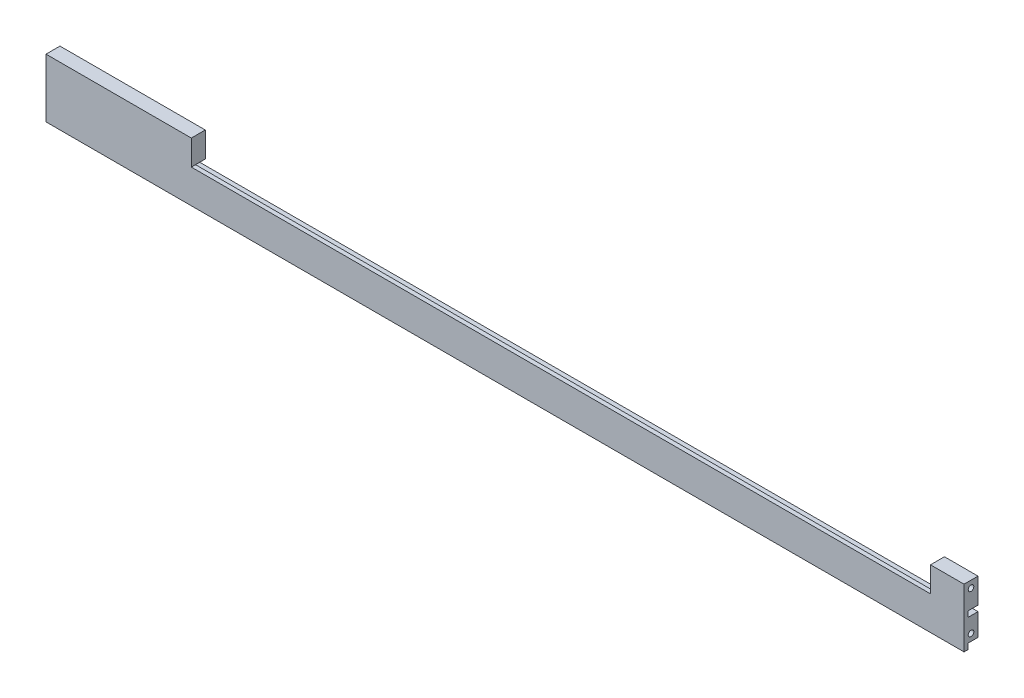
ISO-10303-21;
HEADER;
FILE_DESCRIPTION(('STEP AP214'),'2;1');
FILE_NAME('part.step','',(''),(''),'','','');
FILE_SCHEMA(('AUTOMOTIVE_DESIGN { 1 0 10303 214 1 1 1 1 }'));
ENDSEC;
DATA;
#1=APPLICATION_CONTEXT('core data for automotive mechanical design processes');
#2=APPLICATION_PROTOCOL_DEFINITION('international standard','automotive_design',2000,#1);
#3=PRODUCT_CONTEXT('',#1,'mechanical');
#4=PRODUCT('Part','Part','',(#3));
#5=PRODUCT_RELATED_PRODUCT_CATEGORY('part','',(#4));
#6=PRODUCT_DEFINITION_FORMATION('','',#4);
#7=PRODUCT_DEFINITION_CONTEXT('part definition',#1,'design');
#8=PRODUCT_DEFINITION('design','',#6,#7);
#9=PRODUCT_DEFINITION_SHAPE('','',#8);
#10=(LENGTH_UNIT() NAMED_UNIT(*) SI_UNIT(.MILLI.,.METRE.));
#11=(NAMED_UNIT(*) PLANE_ANGLE_UNIT() SI_UNIT($,.RADIAN.));
#12=(NAMED_UNIT(*) SI_UNIT($,.STERADIAN.) SOLID_ANGLE_UNIT());
#13=UNCERTAINTY_MEASURE_WITH_UNIT(LENGTH_MEASURE(1.E-05),#10,'distance_accuracy_value','');
#14=(GEOMETRIC_REPRESENTATION_CONTEXT(3) GLOBAL_UNCERTAINTY_ASSIGNED_CONTEXT((#13)) GLOBAL_UNIT_ASSIGNED_CONTEXT((#10,
#11,#12)) REPRESENTATION_CONTEXT('',''));
#15=CARTESIAN_POINT('',(0.,0.,0.));
#16=DIRECTION('',(0.,0.,1.));
#17=DIRECTION('',(1.,0.,0.));
#18=AXIS2_PLACEMENT_3D('',#15,#16,#17);
#19=CARTESIAN_POINT('',(-482.706212002234,28.610388862915,10.));
#20=DIRECTION('',(1.,0.,0.));
#21=DIRECTION('',(0.,0.,-1.));
#22=AXIS2_PLACEMENT_3D('',#19,#20,#21);
#23=PLANE('',#22);
#24=CARTESIAN_POINT('',(-482.706212002234,23.610388862915,5.));
#25=DIRECTION('',(-1.,0.,0.));
#26=DIRECTION('',(0.,0.,1.));
#27=AXIS2_PLACEMENT_3D('',#24,#25,#26);
#28=CIRCLE('',#27,2.);
#29=CARTESIAN_POINT('',(-482.706212002234,23.610388862915,7.));
#30=VERTEX_POINT('',#29);
#31=EDGE_CURVE('E330',#30,#30,#28,.T.);
#32=ORIENTED_EDGE('',*,*,#31,.F.);
#33=EDGE_LOOP('',(#32));
#34=FACE_BOUND('',#33,.T.);
#35=CARTESIAN_POINT('',(-482.706212002234,-4.38961113708493,5.));
#36=DIRECTION('',(-1.,0.,0.));
#37=DIRECTION('',(0.,0.,1.));
#38=AXIS2_PLACEMENT_3D('',#35,#36,#37);
#39=CIRCLE('',#38,2.);
#40=CARTESIAN_POINT('',(-482.706212002234,-4.38961113708493,7.));
#41=VERTEX_POINT('',#40);
#42=EDGE_CURVE('E320',#41,#41,#39,.T.);
#43=ORIENTED_EDGE('',*,*,#42,.F.);
#44=EDGE_LOOP('',(#43));
#45=FACE_BOUND('',#44,.T.);
#46=DIRECTION('',(0.,0.,-1.));
#47=VECTOR('',#46,1.);
#48=CARTESIAN_POINT('',(-482.706212002234,-9.38961113708493,7.));
#49=LINE('',#48,#47);
#50=CARTESIAN_POINT('',(-482.706212002234,-9.38961113708493,7.));
#51=VERTEX_POINT('',#50);
#52=CARTESIAN_POINT('',(-482.706212002234,-9.38961113708493,0.));
#53=VERTEX_POINT('',#52);
#54=EDGE_CURVE('E51',#51,#53,#49,.T.);
#55=ORIENTED_EDGE('',*,*,#54,.F.);
#56=DIRECTION('',(0.,1.,0.));
#57=VECTOR('',#56,1.);
#58=CARTESIAN_POINT('',(-482.706212002234,-13.3896111370849,7.));
#59=LINE('',#58,#57);
#60=CARTESIAN_POINT('',(-482.706212002234,-13.3896111370849,7.));
#61=VERTEX_POINT('',#60);
#62=EDGE_CURVE('E148',#61,#51,#59,.T.);
#63=ORIENTED_EDGE('',*,*,#62,.F.);
#64=DIRECTION('',(0.,0.,-1.));
#65=VECTOR('',#64,1.);
#66=CARTESIAN_POINT('',(-482.706212002234,-13.3896111370849,10.));
#67=LINE('',#66,#65);
#68=CARTESIAN_POINT('',(-482.706212002234,-13.3896111370849,10.));
#69=VERTEX_POINT('',#68);
#70=EDGE_CURVE('E240',#69,#61,#67,.T.);
#71=ORIENTED_EDGE('',*,*,#70,.F.);
#72=DIRECTION('',(0.,-1.,0.));
#73=VECTOR('',#72,1.);
#74=CARTESIAN_POINT('',(-482.706212002234,28.610388862915,10.));
#75=LINE('',#74,#73);
#76=CARTESIAN_POINT('',(-482.706212002234,28.610388862915,10.));
#77=VERTEX_POINT('',#76);
#78=EDGE_CURVE('E211',#77,#69,#75,.T.);
#79=ORIENTED_EDGE('',*,*,#78,.F.);
#80=DIRECTION('',(0.,0.,-1.));
#81=VECTOR('',#80,1.);
#82=CARTESIAN_POINT('',(-482.706212002234,28.610388862915,10.));
#83=LINE('',#82,#81);
#84=CARTESIAN_POINT('',(-482.706212002234,28.610388862915,0.));
#85=VERTEX_POINT('',#84);
#86=EDGE_CURVE('E242',#77,#85,#83,.T.);
#87=ORIENTED_EDGE('',*,*,#86,.T.);
#88=DIRECTION('',(0.,-1.,0.));
#89=VECTOR('',#88,1.);
#90=CARTESIAN_POINT('',(-482.706212002234,28.610388862915,0.));
#91=LINE('',#90,#89);
#92=CARTESIAN_POINT('',(-482.706212002234,10.6103888629151,0.));
#93=VERTEX_POINT('',#92);
#94=EDGE_CURVE('E226',#85,#93,#91,.T.);
#95=ORIENTED_EDGE('',*,*,#94,.T.);
#96=DIRECTION('',(0.,0.,-1.));
#97=VECTOR('',#96,1.);
#98=CARTESIAN_POINT('',(-482.706212002234,10.6103888629151,7.));
#99=LINE('',#98,#97);
#100=CARTESIAN_POINT('',(-482.706212002234,10.6103888629151,7.));
#101=VERTEX_POINT('',#100);
#102=EDGE_CURVE('E190',#101,#93,#99,.T.);
#103=ORIENTED_EDGE('',*,*,#102,.F.);
#104=DIRECTION('',(0.,1.,0.));
#105=VECTOR('',#104,1.);
#106=CARTESIAN_POINT('',(-482.706212002234,10.6103888629151,7.));
#107=LINE('',#106,#105);
#108=CARTESIAN_POINT('',(-482.706212002234,6.61038886291507,7.));
#109=VERTEX_POINT('',#108);
#110=EDGE_CURVE('E177',#109,#101,#107,.T.);
#111=ORIENTED_EDGE('',*,*,#110,.F.);
#112=DIRECTION('',(0.,0.,-1.));
#113=VECTOR('',#112,1.);
#114=CARTESIAN_POINT('',(-482.706212002234,6.61038886291507,7.));
#115=LINE('',#114,#113);
#116=CARTESIAN_POINT('',(-482.706212002234,6.61038886291507,0.));
#117=VERTEX_POINT('',#116);
#118=EDGE_CURVE('E192',#109,#117,#115,.T.);
#119=ORIENTED_EDGE('',*,*,#118,.T.);
#120=EDGE_CURVE('E162',#117,#53,#91,.T.);
#121=ORIENTED_EDGE('',*,*,#120,.T.);
#122=EDGE_LOOP('',(#55,#63,#71,#79,#87,#95,#103,#111,#119,#121));
#123=FACE_BOUND('',#122,.T.);
#124=ADVANCED_FACE('F36',(#34,#45,#123),#23,.F.);
#125=CARTESIAN_POINT('',(-482.706212002234,-13.3896111370849,10.));
#126=DIRECTION('',(0.,1.,0.));
#127=DIRECTION('',(-1.,0.,0.));
#128=AXIS2_PLACEMENT_3D('',#125,#126,#127);
#129=PLANE('',#128);
#130=DIRECTION('',(-1.,0.,0.));
#131=VECTOR('',#130,1.);
#132=CARTESIAN_POINT('',(174.293787997766,-13.3896111370849,7.));
#133=LINE('',#132,#131);
#134=CARTESIAN_POINT('',(174.293787997766,-13.3896111370849,7.));
#135=VERTEX_POINT('',#134);
#136=EDGE_CURVE('E154',#135,#61,#133,.T.);
#137=ORIENTED_EDGE('',*,*,#136,.F.);
#138=DIRECTION('',(0.,0.,-1.));
#139=VECTOR('',#138,1.);
#140=CARTESIAN_POINT('',(174.293787997766,-13.3896111370849,10.));
#141=LINE('',#140,#139);
#142=CARTESIAN_POINT('',(174.293787997766,-13.3896111370849,10.));
#143=VERTEX_POINT('',#142);
#144=EDGE_CURVE('E237',#143,#135,#141,.T.);
#145=ORIENTED_EDGE('',*,*,#144,.F.);
#146=DIRECTION('',(1.,0.,0.));
#147=VECTOR('',#146,1.);
#148=CARTESIAN_POINT('',(-482.706212002234,-13.3896111370849,10.));
#149=LINE('',#148,#147);
#150=EDGE_CURVE('E213',#69,#143,#149,.T.);
#151=ORIENTED_EDGE('',*,*,#150,.F.);
#152=ORIENTED_EDGE('',*,*,#70,.T.);
#153=EDGE_LOOP('',(#137,#145,#151,#152));
#154=FACE_BOUND('',#153,.T.);
#155=ADVANCED_FACE('F281',(#154),#129,.F.);
#156=CARTESIAN_POINT('',(174.293787997766,-13.3896111370849,10.));
#157=DIRECTION('',(-1.,0.,0.));
#158=DIRECTION('',(0.,0.,1.));
#159=AXIS2_PLACEMENT_3D('',#156,#157,#158);
#160=PLANE('',#159);
#161=CARTESIAN_POINT('',(174.293787997766,-4.38961113708493,5.));
#162=DIRECTION('',(1.,0.,0.));
#163=DIRECTION('',(0.,0.,-1.));
#164=AXIS2_PLACEMENT_3D('',#161,#162,#163);
#165=CIRCLE('',#164,2.);
#166=CARTESIAN_POINT('',(174.293787997766,-4.38961113708493,3.));
#167=VERTEX_POINT('',#166);
#168=EDGE_CURVE('E312',#167,#167,#165,.T.);
#169=ORIENTED_EDGE('',*,*,#168,.F.);
#170=EDGE_LOOP('',(#169));
#171=FACE_BOUND('',#170,.T.);
#172=CARTESIAN_POINT('',(174.293787997766,23.6103888629151,5.));
#173=DIRECTION('',(1.,0.,0.));
#174=DIRECTION('',(0.,0.,-1.));
#175=AXIS2_PLACEMENT_3D('',#172,#173,#174);
#176=CIRCLE('',#175,2.);
#177=CARTESIAN_POINT('',(174.293787997766,23.6103888629151,3.));
#178=VERTEX_POINT('',#177);
#179=EDGE_CURVE('E317',#178,#178,#176,.T.);
#180=ORIENTED_EDGE('',*,*,#179,.F.);
#181=EDGE_LOOP('',(#180));
#182=FACE_BOUND('',#181,.T.);
#183=DIRECTION('',(0.,0.,-1.));
#184=VECTOR('',#183,1.);
#185=CARTESIAN_POINT('',(174.293787997766,-9.38961113708493,7.));
#186=LINE('',#185,#184);
#187=CARTESIAN_POINT('',(174.293787997766,-9.38961113708493,7.));
#188=VERTEX_POINT('',#187);
#189=CARTESIAN_POINT('',(174.293787997766,-9.38961113708493,0.));
#190=VERTEX_POINT('',#189);
#191=EDGE_CURVE('E145',#188,#190,#186,.T.);
#192=ORIENTED_EDGE('',*,*,#191,.T.);
#193=DIRECTION('',(0.,1.,0.));
#194=VECTOR('',#193,1.);
#195=CARTESIAN_POINT('',(174.293787997766,-13.3896111370849,0.));
#196=LINE('',#195,#194);
#197=CARTESIAN_POINT('',(174.293787997766,6.61038886291507,0.));
#198=VERTEX_POINT('',#197);
#199=EDGE_CURVE('E59',#190,#198,#196,.T.);
#200=ORIENTED_EDGE('',*,*,#199,.T.);
#201=DIRECTION('',(0.,0.,-1.));
#202=VECTOR('',#201,1.);
#203=CARTESIAN_POINT('',(174.293787997766,6.61038886291507,7.));
#204=LINE('',#203,#202);
#205=CARTESIAN_POINT('',(174.293787997766,6.61038886291507,7.));
#206=VERTEX_POINT('',#205);
#207=EDGE_CURVE('E182',#206,#198,#204,.T.);
#208=ORIENTED_EDGE('',*,*,#207,.F.);
#209=DIRECTION('',(0.,-1.,0.));
#210=VECTOR('',#209,1.);
#211=CARTESIAN_POINT('',(174.293787997766,10.6103888629151,7.));
#212=LINE('',#211,#210);
#213=CARTESIAN_POINT('',(174.293787997766,10.6103888629151,7.));
#214=VERTEX_POINT('',#213);
#215=EDGE_CURVE('E171',#214,#206,#212,.T.);
#216=ORIENTED_EDGE('',*,*,#215,.F.);
#217=DIRECTION('',(0.,0.,-1.));
#218=VECTOR('',#217,1.);
#219=CARTESIAN_POINT('',(174.293787997766,10.6103888629151,7.));
#220=LINE('',#219,#218);
#221=CARTESIAN_POINT('',(174.293787997766,10.6103888629151,0.));
#222=VERTEX_POINT('',#221);
#223=EDGE_CURVE('E186',#214,#222,#220,.T.);
#224=ORIENTED_EDGE('',*,*,#223,.T.);
#225=CARTESIAN_POINT('',(174.293787997766,28.6103888629151,0.));
#226=VERTEX_POINT('',#225);
#227=EDGE_CURVE('E229',#222,#226,#196,.T.);
#228=ORIENTED_EDGE('',*,*,#227,.T.);
#229=DIRECTION('',(0.,0.,-1.));
#230=VECTOR('',#229,1.);
#231=CARTESIAN_POINT('',(174.293787997766,28.6103888629151,10.));
#232=LINE('',#231,#230);
#233=CARTESIAN_POINT('',(174.293787997766,28.6103888629151,10.));
#234=VERTEX_POINT('',#233);
#235=EDGE_CURVE('E234',#234,#226,#232,.T.);
#236=ORIENTED_EDGE('',*,*,#235,.F.);
#237=DIRECTION('',(0.,1.,0.));
#238=VECTOR('',#237,1.);
#239=CARTESIAN_POINT('',(174.293787997766,-13.3896111370849,10.));
#240=LINE('',#239,#238);
#241=EDGE_CURVE('E215',#143,#234,#240,.T.);
#242=ORIENTED_EDGE('',*,*,#241,.F.);
#243=ORIENTED_EDGE('',*,*,#144,.T.);
#244=DIRECTION('',(0.,1.,0.));
#245=VECTOR('',#244,1.);
#246=CARTESIAN_POINT('',(174.293787997766,-13.3896111370849,7.));
#247=LINE('',#246,#245);
#248=EDGE_CURVE('E167',#135,#188,#247,.T.);
#249=ORIENTED_EDGE('',*,*,#248,.T.);
#250=EDGE_LOOP('',(#192,#200,#208,#216,#224,#228,#236,#242,#243,#249));
#251=FACE_BOUND('',#250,.T.);
#252=ADVANCED_FACE('F269',(#171,#182,#251),#160,.F.);
#253=CARTESIAN_POINT('',(0.,0.,0.));
#254=DIRECTION('',(0.,0.,-1.));
#255=DIRECTION('',(-1.,0.,0.));
#256=AXIS2_PLACEMENT_3D('',#253,#254,#255);
#257=PLANE('',#256);
#258=ORIENTED_EDGE('',*,*,#199,.F.);
#259=DIRECTION('',(-1.,0.,0.));
#260=VECTOR('',#259,1.);
#261=CARTESIAN_POINT('',(174.293787997766,-9.38961113708493,0.));
#262=LINE('',#261,#260);
#263=EDGE_CURVE('E149',#190,#53,#262,.T.);
#264=ORIENTED_EDGE('',*,*,#263,.T.);
#265=ORIENTED_EDGE('',*,*,#120,.F.);
#266=DIRECTION('',(-1.,0.,0.));
#267=VECTOR('',#266,1.);
#268=CARTESIAN_POINT('',(174.293787997766,6.61038886291507,0.));
#269=LINE('',#268,#267);
#270=EDGE_CURVE('E163',#198,#117,#269,.T.);
#271=ORIENTED_EDGE('',*,*,#270,.F.);
#272=EDGE_LOOP('',(#258,#264,#265,#271));
#273=FACE_BOUND('',#272,.T.);
#274=ADVANCED_FACE('F364',(#273),#257,.T.);
#275=CARTESIAN_POINT('',(150.293787997766,10.6103888629151,10.));
#276=DIRECTION('',(0.,-1.,0.));
#277=DIRECTION('',(1.,0.,0.));
#278=AXIS2_PLACEMENT_3D('',#275,#276,#277);
#279=PLANE('',#278);
#280=DIRECTION('',(1.,0.,0.));
#281=VECTOR('',#280,1.);
#282=CARTESIAN_POINT('',(174.293787997766,10.6103888629151,7.));
#283=LINE('',#282,#281);
#284=CARTESIAN_POINT('',(-378.706212002234,10.6103888629151,7.));
#285=VERTEX_POINT('',#284);
#286=CARTESIAN_POINT('',(150.293787997766,10.6103888629151,7.));
#287=VERTEX_POINT('',#286);
#288=EDGE_CURVE('E183',#285,#287,#283,.T.);
#289=ORIENTED_EDGE('',*,*,#288,.F.);
#290=DIRECTION('',(0.,0.,-1.));
#291=VECTOR('',#290,1.);
#292=CARTESIAN_POINT('',(-378.706212002234,10.610388862915,10.));
#293=LINE('',#292,#291);
#294=CARTESIAN_POINT('',(-378.706212002234,10.610388862915,10.));
#295=VERTEX_POINT('',#294);
#296=EDGE_CURVE('E248',#295,#285,#293,.T.);
#297=ORIENTED_EDGE('',*,*,#296,.F.);
#298=DIRECTION('',(-1.,0.,0.));
#299=VECTOR('',#298,1.);
#300=CARTESIAN_POINT('',(150.293787997766,10.6103888629151,10.));
#301=LINE('',#300,#299);
#302=CARTESIAN_POINT('',(150.293787997766,10.6103888629151,10.));
#303=VERTEX_POINT('',#302);
#304=EDGE_CURVE('E204',#303,#295,#301,.T.);
#305=ORIENTED_EDGE('',*,*,#304,.F.);
#306=DIRECTION('',(0.,0.,-1.));
#307=VECTOR('',#306,1.);
#308=CARTESIAN_POINT('',(150.293787997766,10.6103888629151,10.));
#309=LINE('',#308,#307);
#310=EDGE_CURVE('E44',#303,#287,#309,.T.);
#311=ORIENTED_EDGE('',*,*,#310,.T.);
#312=EDGE_LOOP('',(#289,#297,#305,#311));
#313=FACE_BOUND('',#312,.T.);
#314=ADVANCED_FACE('F254',(#313),#279,.F.);
#315=DIRECTION('',(1.,0.,0.));
#316=VECTOR('',#315,1.);
#317=CARTESIAN_POINT('',(174.293787997766,10.6103888629151,0.));
#318=LINE('',#317,#316);
#319=CARTESIAN_POINT('',(-378.706212002234,10.6103888629151,0.));
#320=VERTEX_POINT('',#319);
#321=EDGE_CURVE('E165',#93,#320,#318,.T.);
#322=ORIENTED_EDGE('',*,*,#321,.F.);
#323=ORIENTED_EDGE('',*,*,#94,.F.);
#324=DIRECTION('',(-1.,0.,0.));
#325=VECTOR('',#324,1.);
#326=CARTESIAN_POINT('',(-378.706212002234,28.610388862915,0.));
#327=LINE('',#326,#325);
#328=CARTESIAN_POINT('',(-378.706212002234,28.610388862915,0.));
#329=VERTEX_POINT('',#328);
#330=EDGE_CURVE('E224',#329,#85,#327,.T.);
#331=ORIENTED_EDGE('',*,*,#330,.F.);
#332=DIRECTION('',(0.,1.,0.));
#333=VECTOR('',#332,1.);
#334=CARTESIAN_POINT('',(-378.706212002234,10.610388862915,0.));
#335=LINE('',#334,#333);
#336=EDGE_CURVE('E222',#320,#329,#335,.T.);
#337=ORIENTED_EDGE('',*,*,#336,.F.);
#338=EDGE_LOOP('',(#322,#323,#331,#337));
#339=FACE_BOUND('',#338,.T.);
#340=ADVANCED_FACE('F363',(#339),#257,.T.);
#341=DIRECTION('',(1.,0.,0.));
#342=VECTOR('',#341,1.);
#343=CARTESIAN_POINT('',(0.,10.6103888629151,0.));
#344=LINE('',#343,#342);
#345=CARTESIAN_POINT('',(150.293787997766,10.6103888629151,0.));
#346=VERTEX_POINT('',#345);
#347=EDGE_CURVE('E11',#346,#222,#344,.T.);
#348=ORIENTED_EDGE('',*,*,#347,.F.);
#349=DIRECTION('',(0.,-1.,0.));
#350=VECTOR('',#349,1.);
#351=CARTESIAN_POINT('',(150.293787997766,28.6103888629151,0.));
#352=LINE('',#351,#350);
#353=CARTESIAN_POINT('',(150.293787997766,28.6103888629151,0.));
#354=VERTEX_POINT('',#353);
#355=EDGE_CURVE('E200',#354,#346,#352,.T.);
#356=ORIENTED_EDGE('',*,*,#355,.F.);
#357=DIRECTION('',(-1.,0.,0.));
#358=VECTOR('',#357,1.);
#359=CARTESIAN_POINT('',(174.293787997766,28.6103888629151,0.));
#360=LINE('',#359,#358);
#361=EDGE_CURVE('E205',#226,#354,#360,.T.);
#362=ORIENTED_EDGE('',*,*,#361,.F.);
#363=ORIENTED_EDGE('',*,*,#227,.F.);
#364=EDGE_LOOP('',(#348,#356,#362,#363));
#365=FACE_BOUND('',#364,.T.);
#366=ADVANCED_FACE('F266',(#365),#257,.T.);
#367=CARTESIAN_POINT('',(150.293787997766,28.6103888629151,10.));
#368=DIRECTION('',(1.,0.,0.));
#369=DIRECTION('',(0.,0.,-1.));
#370=AXIS2_PLACEMENT_3D('',#367,#368,#369);
#371=PLANE('',#370);
#372=ORIENTED_EDGE('',*,*,#355,.T.);
#373=DIRECTION('',(0.,0.,1.));
#374=VECTOR('',#373,1.);
#375=CARTESIAN_POINT('',(150.293787997766,10.6103888629151,10.));
#376=LINE('',#375,#374);
#377=EDGE_CURVE('E197',#346,#287,#376,.T.);
#378=ORIENTED_EDGE('',*,*,#377,.T.);
#379=ORIENTED_EDGE('',*,*,#310,.F.);
#380=DIRECTION('',(0.,-1.,0.));
#381=VECTOR('',#380,1.);
#382=CARTESIAN_POINT('',(150.293787997766,28.6103888629151,10.));
#383=LINE('',#382,#381);
#384=CARTESIAN_POINT('',(150.293787997766,28.6103888629151,10.));
#385=VERTEX_POINT('',#384);
#386=EDGE_CURVE('E201',#385,#303,#383,.T.);
#387=ORIENTED_EDGE('',*,*,#386,.F.);
#388=DIRECTION('',(0.,0.,-1.));
#389=VECTOR('',#388,1.);
#390=CARTESIAN_POINT('',(150.293787997766,28.6103888629151,10.));
#391=LINE('',#390,#389);
#392=EDGE_CURVE('E219',#385,#354,#391,.T.);
#393=ORIENTED_EDGE('',*,*,#392,.T.);
#394=EDGE_LOOP('',(#372,#378,#379,#387,#393));
#395=FACE_BOUND('',#394,.T.);
#396=ADVANCED_FACE('F38',(#395),#371,.F.);
#397=CARTESIAN_POINT('',(-378.706212002234,10.610388862915,10.));
#398=DIRECTION('',(-1.,0.,0.));
#399=DIRECTION('',(0.,0.,1.));
#400=AXIS2_PLACEMENT_3D('',#397,#398,#399);
#401=PLANE('',#400);
#402=ORIENTED_EDGE('',*,*,#336,.T.);
#403=DIRECTION('',(0.,0.,-1.));
#404=VECTOR('',#403,1.);
#405=CARTESIAN_POINT('',(-378.706212002234,28.610388862915,10.));
#406=LINE('',#405,#404);
#407=CARTESIAN_POINT('',(-378.706212002234,28.610388862915,10.));
#408=VERTEX_POINT('',#407);
#409=EDGE_CURVE('E245',#408,#329,#406,.T.);
#410=ORIENTED_EDGE('',*,*,#409,.F.);
#411=DIRECTION('',(0.,1.,0.));
#412=VECTOR('',#411,1.);
#413=CARTESIAN_POINT('',(-378.706212002234,10.610388862915,10.));
#414=LINE('',#413,#412);
#415=EDGE_CURVE('E207',#295,#408,#414,.T.);
#416=ORIENTED_EDGE('',*,*,#415,.F.);
#417=ORIENTED_EDGE('',*,*,#296,.T.);
#418=DIRECTION('',(0.,0.,-1.));
#419=VECTOR('',#418,1.);
#420=CARTESIAN_POINT('',(-378.706212002234,10.610388862915,10.));
#421=LINE('',#420,#419);
#422=EDGE_CURVE('E189',#285,#320,#421,.T.);
#423=ORIENTED_EDGE('',*,*,#422,.T.);
#424=EDGE_LOOP('',(#402,#410,#416,#417,#423));
#425=FACE_BOUND('',#424,.T.);
#426=ADVANCED_FACE('F358',(#425),#401,.F.);
#427=CARTESIAN_POINT('',(-378.706212002234,28.610388862915,10.));
#428=DIRECTION('',(0.,-1.,0.));
#429=DIRECTION('',(1.,0.,0.));
#430=AXIS2_PLACEMENT_3D('',#427,#428,#429);
#431=PLANE('',#430);
#432=ORIENTED_EDGE('',*,*,#330,.T.);
#433=ORIENTED_EDGE('',*,*,#86,.F.);
#434=DIRECTION('',(-1.,0.,0.));
#435=VECTOR('',#434,1.);
#436=CARTESIAN_POINT('',(-378.706212002234,28.610388862915,10.));
#437=LINE('',#436,#435);
#438=EDGE_CURVE('E209',#408,#77,#437,.T.);
#439=ORIENTED_EDGE('',*,*,#438,.F.);
#440=ORIENTED_EDGE('',*,*,#409,.T.);
#441=EDGE_LOOP('',(#432,#433,#439,#440));
#442=FACE_BOUND('',#441,.T.);
#443=ADVANCED_FACE('F355',(#442),#431,.F.);
#444=CARTESIAN_POINT('',(174.293787997766,28.6103888629151,10.));
#445=DIRECTION('',(0.,-1.,0.));
#446=DIRECTION('',(1.,0.,0.));
#447=AXIS2_PLACEMENT_3D('',#444,#445,#446);
#448=PLANE('',#447);
#449=ORIENTED_EDGE('',*,*,#361,.T.);
#450=ORIENTED_EDGE('',*,*,#392,.F.);
#451=DIRECTION('',(-1.,0.,0.));
#452=VECTOR('',#451,1.);
#453=CARTESIAN_POINT('',(174.293787997766,28.6103888629151,10.));
#454=LINE('',#453,#452);
#455=EDGE_CURVE('E217',#234,#385,#454,.T.);
#456=ORIENTED_EDGE('',*,*,#455,.F.);
#457=ORIENTED_EDGE('',*,*,#235,.T.);
#458=EDGE_LOOP('',(#449,#450,#456,#457));
#459=FACE_BOUND('',#458,.T.);
#460=ADVANCED_FACE('F274',(#459),#448,.F.);
#461=CARTESIAN_POINT('',(0.,0.,10.));
#462=DIRECTION('',(0.,0.,-1.));
#463=DIRECTION('',(-1.,0.,0.));
#464=AXIS2_PLACEMENT_3D('',#461,#462,#463);
#465=PLANE('',#464);
#466=ORIENTED_EDGE('',*,*,#386,.T.);
#467=ORIENTED_EDGE('',*,*,#304,.T.);
#468=ORIENTED_EDGE('',*,*,#415,.T.);
#469=ORIENTED_EDGE('',*,*,#438,.T.);
#470=ORIENTED_EDGE('',*,*,#78,.T.);
#471=ORIENTED_EDGE('',*,*,#150,.T.);
#472=ORIENTED_EDGE('',*,*,#241,.T.);
#473=ORIENTED_EDGE('',*,*,#455,.T.);
#474=EDGE_LOOP('',(#466,#467,#468,#469,#470,#471,#472,#473));
#475=FACE_BOUND('',#474,.T.);
#476=ADVANCED_FACE('F277',(#475),#465,.F.);
#477=CARTESIAN_POINT('',(174.293787997766,10.6103888629151,7.));
#478=DIRECTION('',(0.,1.,0.));
#479=DIRECTION('',(-1.,0.,0.));
#480=AXIS2_PLACEMENT_3D('',#477,#478,#479);
#481=PLANE('',#480);
#482=ORIENTED_EDGE('',*,*,#347,.T.);
#483=ORIENTED_EDGE('',*,*,#223,.F.);
#484=EDGE_CURVE('E179',#287,#214,#283,.T.);
#485=ORIENTED_EDGE('',*,*,#484,.F.);
#486=ORIENTED_EDGE('',*,*,#377,.F.);
#487=EDGE_LOOP('',(#482,#483,#485,#486));
#488=FACE_BOUND('',#487,.T.);
#489=ADVANCED_FACE('F262',(#488),#481,.F.);
#490=EDGE_CURVE('E180',#101,#285,#283,.T.);
#491=ORIENTED_EDGE('',*,*,#490,.F.);
#492=ORIENTED_EDGE('',*,*,#102,.T.);
#493=ORIENTED_EDGE('',*,*,#321,.T.);
#494=ORIENTED_EDGE('',*,*,#422,.F.);
#495=EDGE_LOOP('',(#491,#492,#493,#494));
#496=FACE_BOUND('',#495,.T.);
#497=ADVANCED_FACE('F407',(#496),#481,.F.);
#498=CARTESIAN_POINT('',(174.293787997766,6.61038886291507,7.));
#499=DIRECTION('',(0.,-1.,0.));
#500=DIRECTION('',(0.,0.,-1.));
#501=AXIS2_PLACEMENT_3D('',#498,#499,#500);
#502=PLANE('',#501);
#503=ORIENTED_EDGE('',*,*,#270,.T.);
#504=ORIENTED_EDGE('',*,*,#118,.F.);
#505=DIRECTION('',(-1.,0.,0.));
#506=VECTOR('',#505,1.);
#507=CARTESIAN_POINT('',(174.293787997766,6.61038886291507,7.));
#508=LINE('',#507,#506);
#509=EDGE_CURVE('E174',#206,#109,#508,.T.);
#510=ORIENTED_EDGE('',*,*,#509,.F.);
#511=ORIENTED_EDGE('',*,*,#207,.T.);
#512=EDGE_LOOP('',(#503,#504,#510,#511));
#513=FACE_BOUND('',#512,.T.);
#514=ADVANCED_FACE('F414',(#513),#502,.F.);
#515=CARTESIAN_POINT('',(0.,0.,7.));
#516=DIRECTION('',(0.,0.,-1.));
#517=DIRECTION('',(-1.,0.,0.));
#518=AXIS2_PLACEMENT_3D('',#515,#516,#517);
#519=PLANE('',#518);
#520=ORIENTED_EDGE('',*,*,#215,.T.);
#521=ORIENTED_EDGE('',*,*,#509,.T.);
#522=ORIENTED_EDGE('',*,*,#110,.T.);
#523=ORIENTED_EDGE('',*,*,#490,.T.);
#524=ORIENTED_EDGE('',*,*,#288,.T.);
#525=ORIENTED_EDGE('',*,*,#484,.T.);
#526=EDGE_LOOP('',(#520,#521,#522,#523,#524,#525));
#527=FACE_BOUND('',#526,.T.);
#528=ADVANCED_FACE('F421',(#527),#519,.T.);
#529=CARTESIAN_POINT('',(174.293787997766,-9.38961113708493,7.));
#530=DIRECTION('',(0.,-1.,0.));
#531=DIRECTION('',(0.,0.,-1.));
#532=AXIS2_PLACEMENT_3D('',#529,#530,#531);
#533=PLANE('',#532);
#534=CARTESIAN_POINT('',(-432.706212002234,-9.38961113708493,3.5));
#535=DIRECTION('',(0.,-1.,0.));
#536=DIRECTION('',(0.,0.,-1.));
#537=AXIS2_PLACEMENT_3D('',#534,#535,#536);
#538=CIRCLE('',#537,1.49999999999997);
#539=CARTESIAN_POINT('',(-432.706212002234,-9.38961113708493,2.00000000000003));
#540=VERTEX_POINT('',#539);
#541=EDGE_CURVE('E287',#540,#540,#538,.T.);
#542=ORIENTED_EDGE('',*,*,#541,.F.);
#543=EDGE_LOOP('',(#542));
#544=FACE_BOUND('',#543,.T.);
#545=CARTESIAN_POINT('',(-154.206212002234,-9.38961113708493,3.5));
#546=DIRECTION('',(0.,-1.,0.));
#547=DIRECTION('',(0.,0.,-1.));
#548=AXIS2_PLACEMENT_3D('',#545,#546,#547);
#549=CIRCLE('',#548,1.5);
#550=CARTESIAN_POINT('',(-154.206212002234,-9.38961113708493,2.));
#551=VERTEX_POINT('',#550);
#552=EDGE_CURVE('E292',#551,#551,#549,.T.);
#553=ORIENTED_EDGE('',*,*,#552,.F.);
#554=EDGE_LOOP('',(#553));
#555=FACE_BOUND('',#554,.T.);
#556=CARTESIAN_POINT('',(124.293787997766,-9.38961113708493,3.5));
#557=DIRECTION('',(0.,-1.,0.));
#558=DIRECTION('',(0.,0.,-1.));
#559=AXIS2_PLACEMENT_3D('',#556,#557,#558);
#560=CIRCLE('',#559,1.49999999999998);
#561=CARTESIAN_POINT('',(124.293787997766,-9.38961113708493,2.00000000000002));
#562=VERTEX_POINT('',#561);
#563=EDGE_CURVE('E303',#562,#562,#560,.T.);
#564=ORIENTED_EDGE('',*,*,#563,.F.);
#565=EDGE_LOOP('',(#564));
#566=FACE_BOUND('',#565,.T.);
#567=ORIENTED_EDGE('',*,*,#263,.F.);
#568=ORIENTED_EDGE('',*,*,#191,.F.);
#569=DIRECTION('',(-1.,0.,0.));
#570=VECTOR('',#569,1.);
#571=CARTESIAN_POINT('',(174.293787997766,-9.38961113708493,7.));
#572=LINE('',#571,#570);
#573=EDGE_CURVE('E142',#188,#51,#572,.T.);
#574=ORIENTED_EDGE('',*,*,#573,.T.);
#575=ORIENTED_EDGE('',*,*,#54,.T.);
#576=EDGE_LOOP('',(#567,#568,#574,#575));
#577=FACE_BOUND('',#576,.T.);
#578=ADVANCED_FACE('F144',(#544,#555,#566,#577),#533,.T.);
#579=CARTESIAN_POINT('',(0.,0.,7.));
#580=DIRECTION('',(0.,0.,-1.));
#581=DIRECTION('',(-1.,0.,0.));
#582=AXIS2_PLACEMENT_3D('',#579,#580,#581);
#583=PLANE('',#582);
#584=ORIENTED_EDGE('',*,*,#573,.F.);
#585=ORIENTED_EDGE('',*,*,#248,.F.);
#586=ORIENTED_EDGE('',*,*,#136,.T.);
#587=ORIENTED_EDGE('',*,*,#62,.T.);
#588=EDGE_LOOP('',(#584,#585,#586,#587));
#589=FACE_BOUND('',#588,.T.);
#590=ADVANCED_FACE('F152',(#589),#583,.T.);
#591=CARTESIAN_POINT('',(124.293787997766,2.61038886291507,3.5));
#592=DIRECTION('',(0.,-1.,0.));
#593=DIRECTION('',(0.,0.,-1.));
#594=AXIS2_PLACEMENT_3D('',#591,#592,#593);
#595=CYLINDRICAL_SURFACE('',#594,1.49999999999998);
#596=CARTESIAN_POINT('',(124.293787997766,2.61038886291507,3.5));
#597=DIRECTION('',(0.,-1.,0.));
#598=DIRECTION('',(0.,0.,-1.));
#599=AXIS2_PLACEMENT_3D('',#596,#597,#598);
#600=CIRCLE('',#599,1.49999999999998);
#601=CARTESIAN_POINT('',(124.293787997766,2.61038886291507,2.00000000000002));
#602=VERTEX_POINT('',#601);
#603=EDGE_CURVE('E306',#602,#602,#600,.T.);
#604=ORIENTED_EDGE('',*,*,#603,.F.);
#605=EDGE_LOOP('',(#604));
#606=FACE_BOUND('',#605,.T.);
#607=ORIENTED_EDGE('',*,*,#563,.T.);
#608=EDGE_LOOP('',(#607));
#609=FACE_BOUND('',#608,.T.);
#610=ADVANCED_FACE('F445',(#606,#609),#595,.F.);
#611=CARTESIAN_POINT('',(124.293787997766,2.61038886291507,3.5));
#612=DIRECTION('',(0.,-1.,0.));
#613=DIRECTION('',(0.,0.,-1.));
#614=AXIS2_PLACEMENT_3D('',#611,#612,#613);
#615=PLANE('',#614);
#616=ORIENTED_EDGE('',*,*,#603,.T.);
#617=EDGE_LOOP('',(#616));
#618=FACE_BOUND('',#617,.T.);
#619=ADVANCED_FACE('F451',(#618),#615,.T.);
#620=CARTESIAN_POINT('',(-154.206212002234,2.61038886291507,3.5));
#621=DIRECTION('',(0.,-1.,0.));
#622=DIRECTION('',(0.,0.,-1.));
#623=AXIS2_PLACEMENT_3D('',#620,#621,#622);
#624=CYLINDRICAL_SURFACE('',#623,1.5);
#625=CARTESIAN_POINT('',(-154.206212002234,2.61038886291507,3.5));
#626=DIRECTION('',(0.,-1.,0.));
#627=DIRECTION('',(0.,0.,-1.));
#628=AXIS2_PLACEMENT_3D('',#625,#626,#627);
#629=CIRCLE('',#628,1.5);
#630=CARTESIAN_POINT('',(-154.206212002234,2.61038886291507,2.));
#631=VERTEX_POINT('',#630);
#632=EDGE_CURVE('E300',#631,#631,#629,.T.);
#633=ORIENTED_EDGE('',*,*,#632,.F.);
#634=EDGE_LOOP('',(#633));
#635=FACE_BOUND('',#634,.T.);
#636=ORIENTED_EDGE('',*,*,#552,.T.);
#637=EDGE_LOOP('',(#636));
#638=FACE_BOUND('',#637,.T.);
#639=ADVANCED_FACE('F459',(#635,#638),#624,.F.);
#640=CARTESIAN_POINT('',(-154.206212002234,2.61038886291507,3.5));
#641=DIRECTION('',(0.,-1.,0.));
#642=DIRECTION('',(0.,0.,-1.));
#643=AXIS2_PLACEMENT_3D('',#640,#641,#642);
#644=PLANE('',#643);
#645=ORIENTED_EDGE('',*,*,#632,.T.);
#646=EDGE_LOOP('',(#645));
#647=FACE_BOUND('',#646,.T.);
#648=ADVANCED_FACE('F466',(#647),#644,.T.);
#649=CARTESIAN_POINT('',(-432.706212002234,2.61038886291507,3.5));
#650=DIRECTION('',(0.,-1.,0.));
#651=DIRECTION('',(0.,0.,-1.));
#652=AXIS2_PLACEMENT_3D('',#649,#650,#651);
#653=CYLINDRICAL_SURFACE('',#652,1.49999999999997);
#654=CARTESIAN_POINT('',(-432.706212002234,2.61038886291507,3.5));
#655=DIRECTION('',(0.,-1.,0.));
#656=DIRECTION('',(0.,0.,-1.));
#657=AXIS2_PLACEMENT_3D('',#654,#655,#656);
#658=CIRCLE('',#657,1.49999999999997);
#659=CARTESIAN_POINT('',(-432.706212002234,2.61038886291507,2.00000000000003));
#660=VERTEX_POINT('',#659);
#661=EDGE_CURVE('E284',#660,#660,#658,.T.);
#662=ORIENTED_EDGE('',*,*,#661,.F.);
#663=EDGE_LOOP('',(#662));
#664=FACE_BOUND('',#663,.T.);
#665=ORIENTED_EDGE('',*,*,#541,.T.);
#666=EDGE_LOOP('',(#665));
#667=FACE_BOUND('',#666,.T.);
#668=ADVANCED_FACE('F474',(#664,#667),#653,.F.);
#669=CARTESIAN_POINT('',(-432.706212002234,2.61038886291507,3.5));
#670=DIRECTION('',(0.,-1.,0.));
#671=DIRECTION('',(0.,0.,-1.));
#672=AXIS2_PLACEMENT_3D('',#669,#670,#671);
#673=PLANE('',#672);
#674=ORIENTED_EDGE('',*,*,#661,.T.);
#675=EDGE_LOOP('',(#674));
#676=FACE_BOUND('',#675,.T.);
#677=ADVANCED_FACE('F482',(#676),#673,.T.);
#678=CARTESIAN_POINT('',(164.293787997766,23.6103888629151,5.));
#679=DIRECTION('',(1.,0.,0.));
#680=DIRECTION('',(0.,0.,-1.));
#681=AXIS2_PLACEMENT_3D('',#678,#679,#680);
#682=CYLINDRICAL_SURFACE('',#681,2.);
#683=CARTESIAN_POINT('',(164.293787997766,23.6103888629151,5.));
#684=DIRECTION('',(1.,0.,0.));
#685=DIRECTION('',(0.,0.,-1.));
#686=AXIS2_PLACEMENT_3D('',#683,#684,#685);
#687=CIRCLE('',#686,2.);
#688=CARTESIAN_POINT('',(164.293787997766,23.6103888629151,3.));
#689=VERTEX_POINT('',#688);
#690=EDGE_CURVE('E295',#689,#689,#687,.T.);
#691=ORIENTED_EDGE('',*,*,#690,.F.);
#692=EDGE_LOOP('',(#691));
#693=FACE_BOUND('',#692,.T.);
#694=ORIENTED_EDGE('',*,*,#179,.T.);
#695=EDGE_LOOP('',(#694));
#696=FACE_BOUND('',#695,.T.);
#697=ADVANCED_FACE('F490',(#693,#696),#682,.F.);
#698=CARTESIAN_POINT('',(164.293787997766,23.6103888629151,5.));
#699=DIRECTION('',(1.,0.,0.));
#700=DIRECTION('',(0.,0.,-1.));
#701=AXIS2_PLACEMENT_3D('',#698,#699,#700);
#702=PLANE('',#701);
#703=ORIENTED_EDGE('',*,*,#690,.T.);
#704=EDGE_LOOP('',(#703));
#705=FACE_BOUND('',#704,.T.);
#706=ADVANCED_FACE('F498',(#705),#702,.T.);
#707=CARTESIAN_POINT('',(164.293787997766,-4.38961113708493,5.));
#708=DIRECTION('',(1.,0.,0.));
#709=DIRECTION('',(0.,0.,-1.));
#710=AXIS2_PLACEMENT_3D('',#707,#708,#709);
#711=CYLINDRICAL_SURFACE('',#710,2.);
#712=CARTESIAN_POINT('',(164.293787997766,-4.38961113708493,5.));
#713=DIRECTION('',(1.,0.,0.));
#714=DIRECTION('',(0.,0.,-1.));
#715=AXIS2_PLACEMENT_3D('',#712,#713,#714);
#716=CIRCLE('',#715,2.);
#717=CARTESIAN_POINT('',(164.293787997766,-4.38961113708493,3.));
#718=VERTEX_POINT('',#717);
#719=EDGE_CURVE('E308',#718,#718,#716,.T.);
#720=ORIENTED_EDGE('',*,*,#719,.F.);
#721=EDGE_LOOP('',(#720));
#722=FACE_BOUND('',#721,.T.);
#723=ORIENTED_EDGE('',*,*,#168,.T.);
#724=EDGE_LOOP('',(#723));
#725=FACE_BOUND('',#724,.T.);
#726=ADVANCED_FACE('F506',(#722,#725),#711,.F.);
#727=CARTESIAN_POINT('',(164.293787997766,-4.38961113708493,5.));
#728=DIRECTION('',(1.,0.,0.));
#729=DIRECTION('',(0.,0.,-1.));
#730=AXIS2_PLACEMENT_3D('',#727,#728,#729);
#731=PLANE('',#730);
#732=ORIENTED_EDGE('',*,*,#719,.T.);
#733=EDGE_LOOP('',(#732));
#734=FACE_BOUND('',#733,.T.);
#735=ADVANCED_FACE('F513',(#734),#731,.T.);
#736=CARTESIAN_POINT('',(-472.706212002234,-4.38961113708493,5.));
#737=DIRECTION('',(-1.,0.,0.));
#738=DIRECTION('',(0.,0.,1.));
#739=AXIS2_PLACEMENT_3D('',#736,#737,#738);
#740=CYLINDRICAL_SURFACE('',#739,2.);
#741=CARTESIAN_POINT('',(-472.706212002234,-4.38961113708493,5.));
#742=DIRECTION('',(-1.,0.,0.));
#743=DIRECTION('',(0.,0.,1.));
#744=AXIS2_PLACEMENT_3D('',#741,#742,#743);
#745=CIRCLE('',#744,2.);
#746=CARTESIAN_POINT('',(-472.706212002234,-4.38961113708493,7.));
#747=VERTEX_POINT('',#746);
#748=EDGE_CURVE('E335',#747,#747,#745,.T.);
#749=ORIENTED_EDGE('',*,*,#748,.F.);
#750=EDGE_LOOP('',(#749));
#751=FACE_BOUND('',#750,.T.);
#752=ORIENTED_EDGE('',*,*,#42,.T.);
#753=EDGE_LOOP('',(#752));
#754=FACE_BOUND('',#753,.T.);
#755=ADVANCED_FACE('F343',(#751,#754),#740,.F.);
#756=CARTESIAN_POINT('',(-472.706212002234,-4.38961113708493,5.));
#757=DIRECTION('',(-1.,0.,0.));
#758=DIRECTION('',(0.,0.,1.));
#759=AXIS2_PLACEMENT_3D('',#756,#757,#758);
#760=PLANE('',#759);
#761=ORIENTED_EDGE('',*,*,#748,.T.);
#762=EDGE_LOOP('',(#761));
#763=FACE_BOUND('',#762,.T.);
#764=ADVANCED_FACE('F527',(#763),#760,.T.);
#765=CARTESIAN_POINT('',(-472.706212002234,23.610388862915,5.));
#766=DIRECTION('',(-1.,0.,0.));
#767=DIRECTION('',(0.,0.,1.));
#768=AXIS2_PLACEMENT_3D('',#765,#766,#767);
#769=CYLINDRICAL_SURFACE('',#768,2.);
#770=CARTESIAN_POINT('',(-472.706212002234,23.610388862915,5.));
#771=DIRECTION('',(-1.,0.,0.));
#772=DIRECTION('',(0.,0.,1.));
#773=AXIS2_PLACEMENT_3D('',#770,#771,#772);
#774=CIRCLE('',#773,2.);
#775=CARTESIAN_POINT('',(-472.706212002234,23.610388862915,7.));
#776=VERTEX_POINT('',#775);
#777=EDGE_CURVE('E326',#776,#776,#774,.T.);
#778=ORIENTED_EDGE('',*,*,#777,.F.);
#779=EDGE_LOOP('',(#778));
#780=FACE_BOUND('',#779,.T.);
#781=ORIENTED_EDGE('',*,*,#31,.T.);
#782=EDGE_LOOP('',(#781));
#783=FACE_BOUND('',#782,.T.);
#784=ADVANCED_FACE('F535',(#780,#783),#769,.F.);
#785=CARTESIAN_POINT('',(-472.706212002234,23.610388862915,5.));
#786=DIRECTION('',(-1.,0.,0.));
#787=DIRECTION('',(0.,0.,1.));
#788=AXIS2_PLACEMENT_3D('',#785,#786,#787);
#789=PLANE('',#788);
#790=ORIENTED_EDGE('',*,*,#777,.T.);
#791=EDGE_LOOP('',(#790));
#792=FACE_BOUND('',#791,.T.);
#793=ADVANCED_FACE('F542',(#792),#789,.T.);
#794=CLOSED_SHELL('',(#124,#155,#252,#274,#314,#340,#366,#396,#426,#443,#460,#476,#489,#497,
#514,#528,#578,#590,#610,#619,#639,#648,#668,#677,#697,#706,#726,#735,#755,#764,#784,#793));
#795=MANIFOLD_SOLID_BREP('B2',#794);
#796=ADVANCED_BREP_SHAPE_REPRESENTATION('',(#18,#795),#14);
#797=SHAPE_DEFINITION_REPRESENTATION(#9,#796);
ENDSEC;
END-ISO-10303-21;
